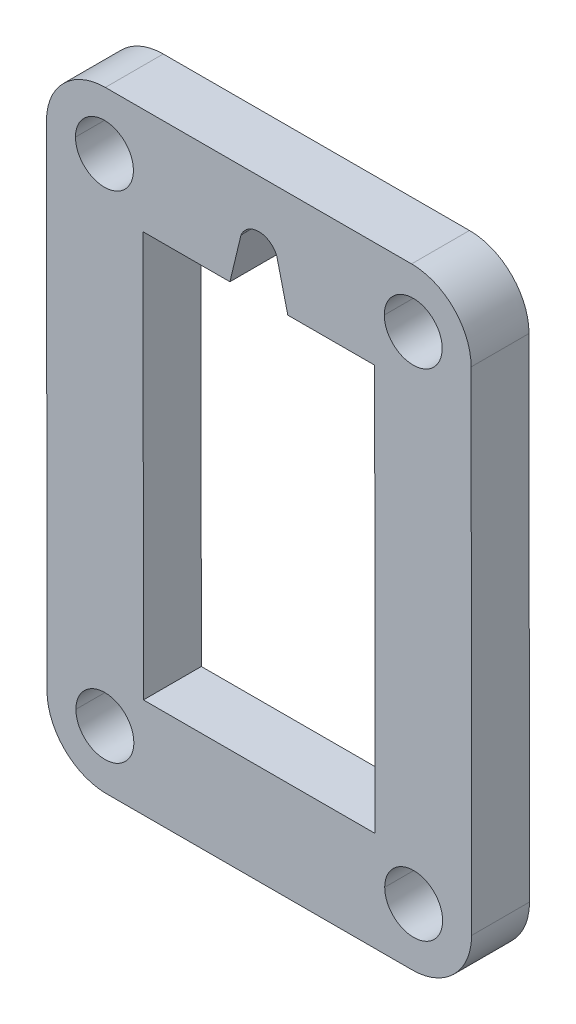
ISO-10303-21;
HEADER;
FILE_DESCRIPTION(('STEP AP214'),'2;1');
FILE_NAME('part.step','',(''),(''),'','','');
FILE_SCHEMA(('AUTOMOTIVE_DESIGN { 1 0 10303 214 1 1 1 1 }'));
ENDSEC;
DATA;
#1=APPLICATION_CONTEXT('core data for automotive mechanical design processes');
#2=APPLICATION_PROTOCOL_DEFINITION('international standard','automotive_design',2000,#1);
#3=PRODUCT_CONTEXT('',#1,'mechanical');
#4=PRODUCT('Part','Part','',(#3));
#5=PRODUCT_RELATED_PRODUCT_CATEGORY('part','',(#4));
#6=PRODUCT_DEFINITION_FORMATION('','',#4);
#7=PRODUCT_DEFINITION_CONTEXT('part definition',#1,'design');
#8=PRODUCT_DEFINITION('design','',#6,#7);
#9=PRODUCT_DEFINITION_SHAPE('','',#8);
#10=(LENGTH_UNIT() NAMED_UNIT(*) SI_UNIT(.MILLI.,.METRE.));
#11=(NAMED_UNIT(*) PLANE_ANGLE_UNIT() SI_UNIT($,.RADIAN.));
#12=(NAMED_UNIT(*) SI_UNIT($,.STERADIAN.) SOLID_ANGLE_UNIT());
#13=UNCERTAINTY_MEASURE_WITH_UNIT(LENGTH_MEASURE(1.E-05),#10,'distance_accuracy_value','');
#14=(GEOMETRIC_REPRESENTATION_CONTEXT(3) GLOBAL_UNCERTAINTY_ASSIGNED_CONTEXT((#13)) GLOBAL_UNIT_ASSIGNED_CONTEXT((#10,
#11,#12)) REPRESENTATION_CONTEXT('',''));
#15=CARTESIAN_POINT('',(0.,0.,0.));
#16=DIRECTION('',(0.,0.,1.));
#17=DIRECTION('',(1.,0.,0.));
#18=AXIS2_PLACEMENT_3D('',#15,#16,#17);
#19=CARTESIAN_POINT('',(256.429080282906,-89.7884732386483,3.175));
#20=DIRECTION('',(0.,0.,-1.));
#21=DIRECTION('',(-1.,0.,0.));
#22=AXIS2_PLACEMENT_3D('',#19,#20,#21);
#23=PLANE('',#22);
#24=CARTESIAN_POINT('',(273.963027726144,-60.3941966704141,3.175));
#25=CARTESIAN_POINT('',(273.963817429087,-61.2709515841344,3.175));
#26=CARTESIAN_POINT('',(274.675202046867,-61.9810558510021,3.175));
#27=CARTESIAN_POINT('',(275.551956960591,-61.9802661480576,3.175));
#28=CARTESIAN_POINT('',(276.428711874314,-61.9794764451143,3.175));
#29=CARTESIAN_POINT('',(277.13881614118,-61.2680918273298,3.175));
#30=CARTESIAN_POINT('',(277.138026438237,-60.3913369136096,3.175));
#31=B_SPLINE_CURVE_WITH_KNOTS('',3,(#24,#25,#26,#27,#28,#29,#30),.UNSPECIFIED.,.F.,.F.,(4,3,4),
(0.,1.,2.),.UNSPECIFIED.);
#32=CARTESIAN_POINT('',(273.963027726144,-60.3941966704141,3.175));
#33=VERTEX_POINT('',#32);
#34=CARTESIAN_POINT('',(277.138026438237,-60.3913369136096,3.175));
#35=VERTEX_POINT('',#34);
#36=EDGE_CURVE('E245',#33,#35,#31,.T.);
#37=ORIENTED_EDGE('',*,*,#36,.F.);
#38=CARTESIAN_POINT('',(277.138026438237,-60.3913369136096,3.175));
#39=CARTESIAN_POINT('',(277.137236735292,-59.51458199989,3.175));
#40=CARTESIAN_POINT('',(276.425852117509,-58.8044777330222,3.175));
#41=CARTESIAN_POINT('',(275.549097203786,-58.8052674359648,3.175));
#42=CARTESIAN_POINT('',(274.672342290063,-58.8060571389094,3.175));
#43=CARTESIAN_POINT('',(273.9622380232,-59.5174417566945,3.175));
#44=CARTESIAN_POINT('',(273.963027726144,-60.3941966704141,3.175));
#45=B_SPLINE_CURVE_WITH_KNOTS('',3,(#38,#39,#40,#41,#42,#43,#44),.UNSPECIFIED.,.F.,.F.,(4,3,4),
(2.,3.,4.),.UNSPECIFIED.);
#46=EDGE_CURVE('E239',#35,#33,#45,.T.);
#47=ORIENTED_EDGE('',*,*,#46,.F.);
#48=EDGE_LOOP('',(#37,#47));
#49=FACE_BOUND('',#48,.T.);
#50=CARTESIAN_POINT('',(257.053349860024,-87.573327313807,3.175));
#51=CARTESIAN_POINT('',(257.054139562969,-88.4500822275324,3.175));
#52=CARTESIAN_POINT('',(257.765524180748,-89.1601864943937,3.175));
#53=CARTESIAN_POINT('',(258.642279094475,-89.1593967914511,3.175));
#54=CARTESIAN_POINT('',(259.519034008194,-89.1586070885066,3.175));
#55=CARTESIAN_POINT('',(260.229138275062,-88.447222470726,3.175));
#56=CARTESIAN_POINT('',(260.228348572117,-87.5704675570012,3.175));
#57=B_SPLINE_CURVE_WITH_KNOTS('',3,(#50,#51,#52,#53,#54,#55,#56),.UNSPECIFIED.,.F.,.F.,(4,3,4),
(0.,1.,2.),.UNSPECIFIED.);
#58=CARTESIAN_POINT('',(257.053349860024,-87.573327313807,3.175));
#59=VERTEX_POINT('',#58);
#60=CARTESIAN_POINT('',(260.228348572117,-87.5704675570012,3.175));
#61=VERTEX_POINT('',#60);
#62=EDGE_CURVE('E308',#59,#61,#57,.T.);
#63=ORIENTED_EDGE('',*,*,#62,.F.);
#64=CARTESIAN_POINT('',(260.228348572117,-87.5704675570012,3.175));
#65=CARTESIAN_POINT('',(260.227558869172,-86.6937126432829,3.175));
#66=CARTESIAN_POINT('',(259.516174251389,-85.9836083764139,3.175));
#67=CARTESIAN_POINT('',(258.639419337667,-85.9843980793571,3.175));
#68=CARTESIAN_POINT('',(257.762664423944,-85.9851877823017,3.175));
#69=CARTESIAN_POINT('',(257.05256015708,-86.696572400088,3.175));
#70=CARTESIAN_POINT('',(257.053349860024,-87.573327313807,3.175));
#71=B_SPLINE_CURVE_WITH_KNOTS('',3,(#64,#65,#66,#67,#68,#69,#70),.UNSPECIFIED.,.F.,.F.,(4,3,4),
(2.,3.,4.),.UNSPECIFIED.);
#72=EDGE_CURVE('E302',#61,#59,#71,.T.);
#73=ORIENTED_EDGE('',*,*,#72,.F.);
#74=EDGE_LOOP('',(#63,#73));
#75=FACE_BOUND('',#74,.T.);
#76=CARTESIAN_POINT('',(255.466574963387,-87.4706715500865,3.175));
#77=CARTESIAN_POINT('',(255.468206151169,-89.2816713851328,3.175));
#78=CARTESIAN_POINT('',(256.937612252825,-90.7484328478704,3.175));
#79=CARTESIAN_POINT('',(258.748612087876,-90.7468016600902,3.175));
#80=B_SPLINE_CURVE_WITH_KNOTS('',3,(#76,#77,#78,#79),.UNSPECIFIED.,.F.,.F.,(4,4),(1.,2.),.UNSPECIFIED.);
#81=CARTESIAN_POINT('',(255.466574963387,-87.4706715500865,3.175));
#82=VERTEX_POINT('',#81);
#83=CARTESIAN_POINT('',(258.748612087876,-90.7468016600902,3.175));
#84=VERTEX_POINT('',#83);
#85=EDGE_CURVE('E432',#82,#84,#80,.T.);
#86=ORIENTED_EDGE('',*,*,#85,.T.);
#87=DIRECTION('',(0.999999594359941,0.000900710804771302,0.));
#88=VECTOR('',#87,1.);
#89=CARTESIAN_POINT('',(258.748612087876,-90.7468016600902,3.175));
#90=LINE('',#89,#88);
#91=CARTESIAN_POINT('',(275.489702302225,-90.7317227731339,3.175));
#92=VERTEX_POINT('',#91);
#93=EDGE_CURVE('E493',#84,#92,#90,.T.);
#94=ORIENTED_EDGE('',*,*,#93,.T.);
#95=CARTESIAN_POINT('',(275.489702302225,-90.7317227731339,3.175));
#96=CARTESIAN_POINT('',(277.291658765287,-90.7300997308182,3.175));
#97=CARTESIAN_POINT('',(278.751127509482,-89.267999496814,3.175));
#98=CARTESIAN_POINT('',(278.749504467165,-87.4660430337482,3.175));
#99=B_SPLINE_CURVE_WITH_KNOTS('',3,(#95,#96,#97,#98),.UNSPECIFIED.,.F.,.F.,(4,4),(3.,4.),.UNSPECIFIED.);
#100=CARTESIAN_POINT('',(278.749504467165,-87.4660430337482,3.175));
#101=VERTEX_POINT('',#100);
#102=EDGE_CURVE('E456',#92,#101,#99,.T.);
#103=ORIENTED_EDGE('',*,*,#102,.T.);
#104=DIRECTION('',(-0.000900710804769986,0.999999594359941,0.));
#105=VECTOR('',#104,1.);
#106=CARTESIAN_POINT('',(278.749504467165,-87.4660430337482,3.175));
#107=LINE('',#106,#105);
#108=CARTESIAN_POINT('',(278.725195719775,-60.4776496437625,3.175));
#109=VERTEX_POINT('',#108);
#110=EDGE_CURVE('E474',#101,#109,#107,.T.);
#111=ORIENTED_EDGE('',*,*,#110,.T.);
#112=CARTESIAN_POINT('',(278.725195719775,-60.4776496437625,3.175));
#113=CARTESIAN_POINT('',(278.723572677461,-58.6756931806992,3.175));
#114=CARTESIAN_POINT('',(277.261472443455,-57.2162244365057,3.175));
#115=CARTESIAN_POINT('',(275.459515980389,-57.2178474788188,3.175));
#116=B_SPLINE_CURVE_WITH_KNOTS('',3,(#112,#113,#114,#115),.UNSPECIFIED.,.F.,.F.,(4,4),(5.,6.),.UNSPECIFIED.);
#117=CARTESIAN_POINT('',(275.459515980389,-57.2178474788188,3.175));
#118=VERTEX_POINT('',#117);
#119=EDGE_CURVE('E471',#109,#118,#116,.T.);
#120=ORIENTED_EDGE('',*,*,#119,.T.);
#121=DIRECTION('',(-0.999999594359941,-0.000900710804881329,0.));
#122=VECTOR('',#121,1.);
#123=CARTESIAN_POINT('',(275.459515980389,-57.2178474788188,3.175));
#124=LINE('',#123,#122);
#125=CARTESIAN_POINT('',(258.666383313464,-57.2329732409954,3.175));
#126=VERTEX_POINT('',#125);
#127=EDGE_CURVE('E385',#118,#126,#124,.T.);
#128=ORIENTED_EDGE('',*,*,#127,.T.);
#129=CARTESIAN_POINT('',(258.666383313464,-57.2329732409954,3.175));
#130=CARTESIAN_POINT('',(256.912873486021,-57.2345526468851,3.175));
#131=CARTESIAN_POINT('',(255.440622499712,-58.6573687576679,3.175));
#132=CARTESIAN_POINT('',(255.442201905602,-60.4108785851117,3.175));
#133=B_SPLINE_CURVE_WITH_KNOTS('',3,(#129,#130,#131,#132),.UNSPECIFIED.,.F.,.F.,(4,4),(8.,9.),.UNSPECIFIED.);
#134=CARTESIAN_POINT('',(255.442201905602,-60.4108785851117,3.175));
#135=VERTEX_POINT('',#134);
#136=EDGE_CURVE('E378',#126,#135,#133,.T.);
#137=ORIENTED_EDGE('',*,*,#136,.T.);
#138=DIRECTION('',(0.000900710805231275,-0.99999959435994,0.));
#139=VECTOR('',#138,1.);
#140=CARTESIAN_POINT('',(255.442201905602,-60.4108785851117,3.175));
#141=LINE('',#140,#139);
#142=EDGE_CURVE('E384',#135,#82,#141,.T.);
#143=ORIENTED_EDGE('',*,*,#142,.T.);
#144=EDGE_LOOP('',(#86,#94,#103,#111,#120,#128,#137,#143));
#145=FACE_BOUND('',#144,.T.);
#146=CARTESIAN_POINT('',(273.986676324518,-87.5580752775126,3.175));
#147=CARTESIAN_POINT('',(273.987466027464,-88.4348301912374,3.175));
#148=CARTESIAN_POINT('',(274.698850645245,-89.1449344581012,3.175));
#149=CARTESIAN_POINT('',(275.575605558968,-89.1441447551567,3.175));
#150=CARTESIAN_POINT('',(276.452360472688,-89.1433550522109,3.175));
#151=CARTESIAN_POINT('',(277.162464739556,-88.4319704344322,3.175));
#152=CARTESIAN_POINT('',(277.161675036611,-87.5552155207068,3.175));
#153=B_SPLINE_CURVE_WITH_KNOTS('',3,(#146,#147,#148,#149,#150,#151,#152),.UNSPECIFIED.,.F.,.F.,
(4,3,4),(0.,1.,2.),.UNSPECIFIED.);
#154=CARTESIAN_POINT('',(273.986676324518,-87.5580752775126,3.175));
#155=VERTEX_POINT('',#154);
#156=CARTESIAN_POINT('',(277.161675036611,-87.5552155207068,3.175));
#157=VERTEX_POINT('',#156);
#158=EDGE_CURVE('E339',#155,#157,#153,.T.);
#159=ORIENTED_EDGE('',*,*,#158,.F.);
#160=CARTESIAN_POINT('',(277.161675036611,-87.5552155207068,3.175));
#161=CARTESIAN_POINT('',(277.160885333667,-86.6784606069878,3.175));
#162=CARTESIAN_POINT('',(276.449500715883,-85.9683563401195,3.175));
#163=CARTESIAN_POINT('',(275.572745802164,-85.9691460430634,3.175));
#164=CARTESIAN_POINT('',(274.695990888438,-85.9699357460073,3.175));
#165=CARTESIAN_POINT('',(273.985886621573,-86.6813203637937,3.175));
#166=CARTESIAN_POINT('',(273.986676324518,-87.5580752775126,3.175));
#167=B_SPLINE_CURVE_WITH_KNOTS('',3,(#160,#161,#162,#163,#164,#165,#166),.UNSPECIFIED.,.F.,.F.,
(4,3,4),(2.,3.,4.),.UNSPECIFIED.);
#168=EDGE_CURVE('E345',#157,#155,#167,.T.);
#169=ORIENTED_EDGE('',*,*,#168,.F.);
#170=EDGE_LOOP('',(#159,#169));
#171=FACE_BOUND('',#170,.T.);
#172=CARTESIAN_POINT('',(267.082978118885,-59.8712267266286,3.175));
#173=CARTESIAN_POINT('',(266.642307521266,-59.8716236435582,3.175));
#174=CARTESIAN_POINT('',(266.264795534188,-60.1412841216985,3.175));
#175=CARTESIAN_POINT('',(266.105912571669,-60.5244358753871,3.175));
#176=B_SPLINE_CURVE_WITH_KNOTS('',3,(#172,#173,#174,#175),.UNSPECIFIED.,.F.,.F.,(4,4),(5.,6.),.UNSPECIFIED.);
#177=CARTESIAN_POINT('',(267.082978118885,-59.8712267266286,3.175));
#178=VERTEX_POINT('',#177);
#179=CARTESIAN_POINT('',(266.105912571669,-60.5244358753871,3.175));
#180=VERTEX_POINT('',#179);
#181=EDGE_CURVE('E275',#178,#180,#176,.T.);
#182=ORIENTED_EDGE('',*,*,#181,.F.);
#183=CARTESIAN_POINT('',(268.06275090101,-60.5263983402516,3.175));
#184=CARTESIAN_POINT('',(267.904080531669,-60.1415516796852,3.175));
#185=CARTESIAN_POINT('',(267.525069817808,-59.8708285296969,3.175));
#186=CARTESIAN_POINT('',(267.082978118885,-59.8712267266286,3.175));
#187=B_SPLINE_CURVE_WITH_KNOTS('',3,(#183,#184,#185,#186),.UNSPECIFIED.,.F.,.F.,(4,4),(6.,7.),.UNSPECIFIED.);
#188=CARTESIAN_POINT('',(268.06275090101,-60.5263983402516,3.175));
#189=VERTEX_POINT('',#188);
#190=EDGE_CURVE('E533',#189,#178,#187,.T.);
#191=ORIENTED_EDGE('',*,*,#190,.F.);
#192=DIRECTION('',(-0.235624005462712,0.971844292080634,0.));
#193=VECTOR('',#192,1.);
#194=CARTESIAN_POINT('',(268.06275090101,-60.5263983402516,3.175));
#195=LINE('',#194,#193);
#196=CARTESIAN_POINT('',(268.673337231736,-63.0447955603188,3.175));
#197=VERTEX_POINT('',#196);
#198=EDGE_CURVE('E597',#197,#189,#195,.T.);
#199=ORIENTED_EDGE('',*,*,#198,.F.);
#200=DIRECTION('',(-0.999999594359941,-0.000900710804908462,0.));
#201=VECTOR('',#200,1.);
#202=CARTESIAN_POINT('',(268.673337231736,-63.0447955603188,3.175));
#203=LINE('',#202,#201);
#204=CARTESIAN_POINT('',(273.435835299875,-63.0405059251104,3.175));
#205=VERTEX_POINT('',#204);
#206=EDGE_CURVE('E640',#205,#197,#203,.T.);
#207=ORIENTED_EDGE('',*,*,#206,.F.);
#208=DIRECTION('',(-0.000900710804858463,0.999999594359941,0.));
#209=VECTOR('',#208,1.);
#210=CARTESIAN_POINT('',(273.435835299875,-63.0405059251104,3.175));
#211=LINE('',#210,#209);
#212=CARTESIAN_POINT('',(273.455853597513,-85.2654969097612,3.175));
#213=VERTEX_POINT('',#212);
#214=EDGE_CURVE('E641',#213,#205,#211,.T.);
#215=ORIENTED_EDGE('',*,*,#214,.F.);
#216=DIRECTION('',(0.999999594359941,0.000900710804775148,0.));
#217=VECTOR('',#216,1.);
#218=CARTESIAN_POINT('',(273.455853597513,-85.2654969097612,3.175));
#219=LINE('',#218,#217);
#220=CARTESIAN_POINT('',(260.755858749142,-85.2769359369819,3.175));
#221=VERTEX_POINT('',#220);
#222=EDGE_CURVE('E643',#221,#213,#219,.T.);
#223=ORIENTED_EDGE('',*,*,#222,.F.);
#224=DIRECTION('',(0.000900710804868478,-0.999999594359941,0.));
#225=VECTOR('',#224,1.);
#226=CARTESIAN_POINT('',(260.755858749142,-85.2769359369819,3.175));
#227=LINE('',#226,#225);
#228=CARTESIAN_POINT('',(260.735840451504,-63.0519449523316,3.175));
#229=VERTEX_POINT('',#228);
#230=EDGE_CURVE('E647',#229,#221,#227,.T.);
#231=ORIENTED_EDGE('',*,*,#230,.F.);
#232=DIRECTION('',(-0.999999594359941,-0.000900710804765625,0.));
#233=VECTOR('',#232,1.);
#234=CARTESIAN_POINT('',(260.735840451504,-63.0519449523316,3.175));
#235=LINE('',#234,#233);
#236=CARTESIAN_POINT('',(265.498338519643,-63.0476553171239,3.175));
#237=VERTEX_POINT('',#236);
#238=EDGE_CURVE('E648',#237,#229,#235,.T.);
#239=ORIENTED_EDGE('',*,*,#238,.F.);
#240=DIRECTION('',(-0.234102034358403,-0.972212033205338,0.));
#241=VECTOR('',#240,1.);
#242=CARTESIAN_POINT('',(265.498338519643,-63.0476553171239,3.175));
#243=LINE('',#242,#241);
#244=EDGE_CURVE('E280',#180,#237,#243,.T.);
#245=ORIENTED_EDGE('',*,*,#244,.F.);
#246=EDGE_LOOP('',(#182,#191,#199,#207,#215,#223,#231,#239,#245));
#247=FACE_BOUND('',#246,.T.);
#248=CARTESIAN_POINT('',(257.02970126165,-60.4094487067091,3.175));
#249=CARTESIAN_POINT('',(257.030490964593,-61.2862036204294,3.175));
#250=CARTESIAN_POINT('',(257.741875582373,-61.9963078872958,3.175));
#251=CARTESIAN_POINT('',(258.618630496097,-61.9955181843513,3.175));
#252=CARTESIAN_POINT('',(259.495385409818,-61.9947284814093,3.175));
#253=CARTESIAN_POINT('',(260.205489676686,-61.2833438636242,3.175));
#254=CARTESIAN_POINT('',(260.204699973742,-60.4065889499039,3.175));
#255=B_SPLINE_CURVE_WITH_KNOTS('',3,(#248,#249,#250,#251,#252,#253,#254),.UNSPECIFIED.,.F.,.F.,
(4,3,4),(0.,1.,2.),.UNSPECIFIED.);
#256=CARTESIAN_POINT('',(257.02970126165,-60.4094487067091,3.175));
#257=VERTEX_POINT('',#256);
#258=CARTESIAN_POINT('',(260.204699973742,-60.4065889499039,3.175));
#259=VERTEX_POINT('',#258);
#260=EDGE_CURVE('E210',#257,#259,#255,.T.);
#261=ORIENTED_EDGE('',*,*,#260,.F.);
#262=CARTESIAN_POINT('',(260.204699973742,-60.4065889499039,3.175));
#263=CARTESIAN_POINT('',(260.203910270797,-59.5298340361849,3.175));
#264=CARTESIAN_POINT('',(259.492525653015,-58.8197297693172,3.175));
#265=CARTESIAN_POINT('',(258.615770739292,-58.8205194722598,3.175));
#266=CARTESIAN_POINT('',(257.739015825569,-58.8213091752037,3.175));
#267=CARTESIAN_POINT('',(257.028911558704,-59.5326937929901,3.175));
#268=CARTESIAN_POINT('',(257.02970126165,-60.4094487067091,3.175));
#269=B_SPLINE_CURVE_WITH_KNOTS('',3,(#262,#263,#264,#265,#266,#267,#268),.UNSPECIFIED.,.F.,.F.,
(4,3,4),(2.,3.,4.),.UNSPECIFIED.);
#270=EDGE_CURVE('E204',#259,#257,#269,.T.);
#271=ORIENTED_EDGE('',*,*,#270,.F.);
#272=EDGE_LOOP('',(#261,#271));
#273=FACE_BOUND('',#272,.T.);
#274=ADVANCED_FACE('F37',(#49,#75,#145,#171,#247,#273),#23,.F.);
#275=CARTESIAN_POINT('',(256.429080282906,-89.7884732386483,0.));
#276=DIRECTION('',(0.,0.,-1.));
#277=DIRECTION('',(-1.,0.,0.));
#278=AXIS2_PLACEMENT_3D('',#275,#276,#277);
#279=PLANE('',#278);
#280=CARTESIAN_POINT('',(277.138026438237,-60.3913369136096,0.));
#281=CARTESIAN_POINT('',(277.137236735292,-59.51458199989,0.));
#282=CARTESIAN_POINT('',(276.425852117509,-58.8044777330222,0.));
#283=CARTESIAN_POINT('',(275.549097203786,-58.8052674359648,0.));
#284=CARTESIAN_POINT('',(274.672342290063,-58.8060571389094,0.));
#285=CARTESIAN_POINT('',(273.9622380232,-59.5174417566945,0.));
#286=CARTESIAN_POINT('',(273.963027726144,-60.3941966704141,0.));
#287=B_SPLINE_CURVE_WITH_KNOTS('',3,(#280,#281,#282,#283,#284,#285,#286),.UNSPECIFIED.,.F.,.F.,
(4,3,4),(2.,3.,4.),.UNSPECIFIED.);
#288=CARTESIAN_POINT('',(277.138026438237,-60.3913369136096,0.));
#289=VERTEX_POINT('',#288);
#290=CARTESIAN_POINT('',(273.963027726144,-60.3941966704141,0.));
#291=VERTEX_POINT('',#290);
#292=EDGE_CURVE('E258',#289,#291,#287,.T.);
#293=ORIENTED_EDGE('',*,*,#292,.T.);
#294=CARTESIAN_POINT('',(273.963027726144,-60.3941966704141,0.));
#295=CARTESIAN_POINT('',(273.963817429087,-61.2709515841344,0.));
#296=CARTESIAN_POINT('',(274.675202046867,-61.9810558510021,0.));
#297=CARTESIAN_POINT('',(275.551956960591,-61.9802661480576,0.));
#298=CARTESIAN_POINT('',(276.428711874314,-61.9794764451143,0.));
#299=CARTESIAN_POINT('',(277.13881614118,-61.2680918273298,0.));
#300=CARTESIAN_POINT('',(277.138026438237,-60.3913369136096,0.));
#301=B_SPLINE_CURVE_WITH_KNOTS('',3,(#294,#295,#296,#297,#298,#299,#300),.UNSPECIFIED.,.F.,.F.,
(4,3,4),(0.,1.,2.),.UNSPECIFIED.);
#302=EDGE_CURVE('E250',#291,#289,#301,.T.);
#303=ORIENTED_EDGE('',*,*,#302,.T.);
#304=EDGE_LOOP('',(#293,#303));
#305=FACE_BOUND('',#304,.T.);
#306=CARTESIAN_POINT('',(260.228348572117,-87.5704675570012,0.));
#307=CARTESIAN_POINT('',(260.227558869172,-86.6937126432829,0.));
#308=CARTESIAN_POINT('',(259.516174251389,-85.9836083764139,0.));
#309=CARTESIAN_POINT('',(258.639419337667,-85.9843980793571,0.));
#310=CARTESIAN_POINT('',(257.762664423944,-85.9851877823017,0.));
#311=CARTESIAN_POINT('',(257.05256015708,-86.696572400088,0.));
#312=CARTESIAN_POINT('',(257.053349860024,-87.573327313807,0.));
#313=B_SPLINE_CURVE_WITH_KNOTS('',3,(#306,#307,#308,#309,#310,#311,#312),.UNSPECIFIED.,.F.,.F.,
(4,3,4),(2.,3.,4.),.UNSPECIFIED.);
#314=CARTESIAN_POINT('',(260.228348572117,-87.5704675570012,0.));
#315=VERTEX_POINT('',#314);
#316=CARTESIAN_POINT('',(257.053349860024,-87.573327313807,0.));
#317=VERTEX_POINT('',#316);
#318=EDGE_CURVE('E321',#315,#317,#313,.T.);
#319=ORIENTED_EDGE('',*,*,#318,.T.);
#320=CARTESIAN_POINT('',(257.053349860024,-87.573327313807,0.));
#321=CARTESIAN_POINT('',(257.054139562969,-88.4500822275324,0.));
#322=CARTESIAN_POINT('',(257.765524180748,-89.1601864943937,0.));
#323=CARTESIAN_POINT('',(258.642279094475,-89.1593967914511,0.));
#324=CARTESIAN_POINT('',(259.519034008194,-89.1586070885066,0.));
#325=CARTESIAN_POINT('',(260.229138275062,-88.447222470726,0.));
#326=CARTESIAN_POINT('',(260.228348572117,-87.5704675570012,0.));
#327=B_SPLINE_CURVE_WITH_KNOTS('',3,(#320,#321,#322,#323,#324,#325,#326),.UNSPECIFIED.,.F.,.F.,
(4,3,4),(0.,1.,2.),.UNSPECIFIED.);
#328=EDGE_CURVE('E313',#317,#315,#327,.T.);
#329=ORIENTED_EDGE('',*,*,#328,.T.);
#330=EDGE_LOOP('',(#319,#329));
#331=FACE_BOUND('',#330,.T.);
#332=CARTESIAN_POINT('',(255.466574963387,-87.4706715500865,0.));
#333=CARTESIAN_POINT('',(255.468206151169,-89.2816713851328,0.));
#334=CARTESIAN_POINT('',(256.937612252825,-90.7484328478704,0.));
#335=CARTESIAN_POINT('',(258.748612087876,-90.7468016600902,0.));
#336=B_SPLINE_CURVE_WITH_KNOTS('',3,(#332,#333,#334,#335),.UNSPECIFIED.,.F.,.F.,(4,4),(1.,2.),.UNSPECIFIED.);
#337=CARTESIAN_POINT('',(255.466574963387,-87.4706715500865,0.));
#338=VERTEX_POINT('',#337);
#339=CARTESIAN_POINT('',(258.748612087876,-90.7468016600902,0.));
#340=VERTEX_POINT('',#339);
#341=EDGE_CURVE('E392',#338,#340,#336,.T.);
#342=ORIENTED_EDGE('',*,*,#341,.F.);
#343=DIRECTION('',(0.000900710804481159,-0.999999594359941,0.));
#344=VECTOR('',#343,1.);
#345=CARTESIAN_POINT('',(255.463068592328,-83.5777798254368,0.));
#346=LINE('',#345,#344);
#347=CARTESIAN_POINT('',(255.442201905602,-60.4108785851117,0.));
#348=VERTEX_POINT('',#347);
#349=EDGE_CURVE('E427',#348,#338,#346,.T.);
#350=ORIENTED_EDGE('',*,*,#349,.F.);
#351=CARTESIAN_POINT('',(258.666383313464,-57.2329732409954,0.));
#352=CARTESIAN_POINT('',(256.912873486021,-57.2345526468851,0.));
#353=CARTESIAN_POINT('',(255.440622499712,-58.6573687576679,0.));
#354=CARTESIAN_POINT('',(255.442201905602,-60.4108785851117,0.));
#355=B_SPLINE_CURVE_WITH_KNOTS('',3,(#351,#352,#353,#354),.UNSPECIFIED.,.F.,.F.,(4,4),(8.,9.),.UNSPECIFIED.);
#356=CARTESIAN_POINT('',(258.666383313464,-57.2329732409954,0.));
#357=VERTEX_POINT('',#356);
#358=EDGE_CURVE('E422',#357,#348,#355,.T.);
#359=ORIENTED_EDGE('',*,*,#358,.F.);
#360=DIRECTION('',(-0.999999594359938,-0.000900710807447061,0.));
#361=VECTOR('',#360,1.);
#362=CARTESIAN_POINT('',(258.701673996036,-57.2329414542833,0.));
#363=LINE('',#362,#361);
#364=CARTESIAN_POINT('',(275.459515980389,-57.2178474788188,0.));
#365=VERTEX_POINT('',#364);
#366=EDGE_CURVE('E417',#365,#357,#363,.T.);
#367=ORIENTED_EDGE('',*,*,#366,.F.);
#368=CARTESIAN_POINT('',(278.725195719775,-60.4776496437625,0.));
#369=CARTESIAN_POINT('',(278.723572677461,-58.6756931806992,0.));
#370=CARTESIAN_POINT('',(277.261472443455,-57.2162244365057,0.));
#371=CARTESIAN_POINT('',(275.459515980389,-57.2178474788188,0.));
#372=B_SPLINE_CURVE_WITH_KNOTS('',3,(#368,#369,#370,#371),.UNSPECIFIED.,.F.,.F.,(4,4),(5.,6.),.UNSPECIFIED.);
#373=CARTESIAN_POINT('',(278.725195719775,-60.4776496437625,0.));
#374=VERTEX_POINT('',#373);
#375=EDGE_CURVE('E412',#374,#365,#372,.T.);
#376=ORIENTED_EDGE('',*,*,#375,.F.);
#377=DIRECTION('',(-0.000900710804769986,0.999999594359941,0.));
#378=VECTOR('',#377,1.);
#379=CARTESIAN_POINT('',(278.749504467165,-87.4660430337482,0.));
#380=LINE('',#379,#378);
#381=CARTESIAN_POINT('',(278.749504467165,-87.4660430337482,0.));
#382=VERTEX_POINT('',#381);
#383=EDGE_CURVE('E407',#382,#374,#380,.T.);
#384=ORIENTED_EDGE('',*,*,#383,.F.);
#385=CARTESIAN_POINT('',(275.489702302225,-90.7317227731339,0.));
#386=CARTESIAN_POINT('',(277.291658765287,-90.7300997308182,0.));
#387=CARTESIAN_POINT('',(278.751127509482,-89.267999496814,0.));
#388=CARTESIAN_POINT('',(278.749504467165,-87.4660430337482,0.));
#389=B_SPLINE_CURVE_WITH_KNOTS('',3,(#385,#386,#387,#388),.UNSPECIFIED.,.F.,.F.,(4,4),(3.,4.),.UNSPECIFIED.);
#390=CARTESIAN_POINT('',(275.489702302225,-90.7317227731339,0.));
#391=VERTEX_POINT('',#390);
#392=EDGE_CURVE('E403',#391,#382,#389,.T.);
#393=ORIENTED_EDGE('',*,*,#392,.F.);
#394=DIRECTION('',(0.999999594359941,0.000900710804771302,0.));
#395=VECTOR('',#394,1.);
#396=CARTESIAN_POINT('',(258.748612087876,-90.7468016600902,0.));
#397=LINE('',#396,#395);
#398=EDGE_CURVE('E397',#340,#391,#397,.T.);
#399=ORIENTED_EDGE('',*,*,#398,.F.);
#400=EDGE_LOOP('',(#342,#350,#359,#367,#376,#384,#393,#399));
#401=FACE_BOUND('',#400,.T.);
#402=CARTESIAN_POINT('',(277.161675036611,-87.5552155207068,0.));
#403=CARTESIAN_POINT('',(277.160885333667,-86.6784606069878,0.));
#404=CARTESIAN_POINT('',(276.449500715883,-85.9683563401195,0.));
#405=CARTESIAN_POINT('',(275.572745802164,-85.9691460430634,0.));
#406=CARTESIAN_POINT('',(274.695990888438,-85.9699357460073,0.));
#407=CARTESIAN_POINT('',(273.985886621573,-86.6813203637937,0.));
#408=CARTESIAN_POINT('',(273.986676324518,-87.5580752775126,0.));
#409=B_SPLINE_CURVE_WITH_KNOTS('',3,(#402,#403,#404,#405,#406,#407,#408),.UNSPECIFIED.,.F.,.F.,
(4,3,4),(2.,3.,4.),.UNSPECIFIED.);
#410=CARTESIAN_POINT('',(277.161675036611,-87.5552155207068,0.));
#411=VERTEX_POINT('',#410);
#412=CARTESIAN_POINT('',(273.986676324518,-87.5580752775126,0.));
#413=VERTEX_POINT('',#412);
#414=EDGE_CURVE('E346',#411,#413,#409,.T.);
#415=ORIENTED_EDGE('',*,*,#414,.T.);
#416=CARTESIAN_POINT('',(273.986676324518,-87.5580752775126,0.));
#417=CARTESIAN_POINT('',(273.987466027464,-88.4348301912374,0.));
#418=CARTESIAN_POINT('',(274.698850645245,-89.1449344581012,0.));
#419=CARTESIAN_POINT('',(275.575605558968,-89.1441447551567,0.));
#420=CARTESIAN_POINT('',(276.452360472688,-89.1433550522109,0.));
#421=CARTESIAN_POINT('',(277.162464739556,-88.4319704344322,0.));
#422=CARTESIAN_POINT('',(277.161675036611,-87.5552155207068,0.));
#423=B_SPLINE_CURVE_WITH_KNOTS('',3,(#416,#417,#418,#419,#420,#421,#422),.UNSPECIFIED.,.F.,.F.,
(4,3,4),(0.,1.,2.),.UNSPECIFIED.);
#424=EDGE_CURVE('E338',#413,#411,#423,.T.);
#425=ORIENTED_EDGE('',*,*,#424,.T.);
#426=EDGE_LOOP('',(#415,#425));
#427=FACE_BOUND('',#426,.T.);
#428=CARTESIAN_POINT('',(268.06275090101,-60.5263983402516,0.));
#429=CARTESIAN_POINT('',(267.904080531669,-60.1415516796852,0.));
#430=CARTESIAN_POINT('',(267.525069817808,-59.8708285296969,0.));
#431=CARTESIAN_POINT('',(267.082978118885,-59.8712267266286,0.));
#432=B_SPLINE_CURVE_WITH_KNOTS('',3,(#428,#429,#430,#431),.UNSPECIFIED.,.F.,.F.,(4,4),(6.,7.),.UNSPECIFIED.);
#433=CARTESIAN_POINT('',(268.06275090101,-60.5263983402516,0.));
#434=VERTEX_POINT('',#433);
#435=CARTESIAN_POINT('',(267.082978118885,-59.8712267266286,0.));
#436=VERTEX_POINT('',#435);
#437=EDGE_CURVE('E281',#434,#436,#432,.T.);
#438=ORIENTED_EDGE('',*,*,#437,.T.);
#439=CARTESIAN_POINT('',(267.082978118885,-59.8712267266286,0.));
#440=CARTESIAN_POINT('',(266.642307521266,-59.8716236435582,0.));
#441=CARTESIAN_POINT('',(266.264795534188,-60.1412841216985,0.));
#442=CARTESIAN_POINT('',(266.105912571669,-60.5244358753871,0.));
#443=B_SPLINE_CURVE_WITH_KNOTS('',3,(#439,#440,#441,#442),.UNSPECIFIED.,.F.,.F.,(4,4),(5.,6.),.UNSPECIFIED.);
#444=CARTESIAN_POINT('',(266.105912571669,-60.5244358753871,0.));
#445=VERTEX_POINT('',#444);
#446=EDGE_CURVE('E274',#436,#445,#443,.T.);
#447=ORIENTED_EDGE('',*,*,#446,.T.);
#448=DIRECTION('',(-0.234102034358403,-0.972212033205338,0.));
#449=VECTOR('',#448,1.);
#450=CARTESIAN_POINT('',(265.498338519643,-63.0476553171239,0.));
#451=LINE('',#450,#449);
#452=CARTESIAN_POINT('',(265.498338519643,-63.0476553171239,0.));
#453=VERTEX_POINT('',#452);
#454=EDGE_CURVE('E544',#445,#453,#451,.T.);
#455=ORIENTED_EDGE('',*,*,#454,.T.);
#456=DIRECTION('',(-0.999999594359941,-0.000900710804765625,0.));
#457=VECTOR('',#456,1.);
#458=CARTESIAN_POINT('',(260.735840451504,-63.0519449523316,0.));
#459=LINE('',#458,#457);
#460=CARTESIAN_POINT('',(260.735840451504,-63.0519449523316,0.));
#461=VERTEX_POINT('',#460);
#462=EDGE_CURVE('E583',#453,#461,#459,.T.);
#463=ORIENTED_EDGE('',*,*,#462,.T.);
#464=DIRECTION('',(0.000900710804868478,-0.999999594359941,0.));
#465=VECTOR('',#464,1.);
#466=CARTESIAN_POINT('',(260.755858749142,-85.2769359369819,0.));
#467=LINE('',#466,#465);
#468=CARTESIAN_POINT('',(260.755858749142,-85.2769359369819,0.));
#469=VERTEX_POINT('',#468);
#470=EDGE_CURVE('E580',#461,#469,#467,.T.);
#471=ORIENTED_EDGE('',*,*,#470,.T.);
#472=DIRECTION('',(0.999999594359941,0.000900710804775148,0.));
#473=VECTOR('',#472,1.);
#474=CARTESIAN_POINT('',(273.455853597513,-85.2654969097612,0.));
#475=LINE('',#474,#473);
#476=CARTESIAN_POINT('',(273.455853597513,-85.2654969097612,0.));
#477=VERTEX_POINT('',#476);
#478=EDGE_CURVE('E577',#469,#477,#475,.T.);
#479=ORIENTED_EDGE('',*,*,#478,.T.);
#480=DIRECTION('',(-0.000900710804858463,0.999999594359941,0.));
#481=VECTOR('',#480,1.);
#482=CARTESIAN_POINT('',(273.435835299875,-63.0405059251104,0.));
#483=LINE('',#482,#481);
#484=CARTESIAN_POINT('',(273.435835299875,-63.0405059251104,0.));
#485=VERTEX_POINT('',#484);
#486=EDGE_CURVE('E574',#477,#485,#483,.T.);
#487=ORIENTED_EDGE('',*,*,#486,.T.);
#488=DIRECTION('',(-0.999999594359941,-0.000900710804908462,0.));
#489=VECTOR('',#488,1.);
#490=CARTESIAN_POINT('',(268.673337231736,-63.0447955603188,0.));
#491=LINE('',#490,#489);
#492=CARTESIAN_POINT('',(268.673337231736,-63.0447955603188,0.));
#493=VERTEX_POINT('',#492);
#494=EDGE_CURVE('E571',#485,#493,#491,.T.);
#495=ORIENTED_EDGE('',*,*,#494,.T.);
#496=DIRECTION('',(-0.235624005462712,0.971844292080634,0.));
#497=VECTOR('',#496,1.);
#498=CARTESIAN_POINT('',(268.06275090101,-60.5263983402516,0.));
#499=LINE('',#498,#497);
#500=EDGE_CURVE('E565',#493,#434,#499,.T.);
#501=ORIENTED_EDGE('',*,*,#500,.T.);
#502=EDGE_LOOP('',(#438,#447,#455,#463,#471,#479,#487,#495,#501));
#503=FACE_BOUND('',#502,.T.);
#504=CARTESIAN_POINT('',(260.204699973742,-60.4065889499039,0.));
#505=CARTESIAN_POINT('',(260.203910270797,-59.5298340361849,0.));
#506=CARTESIAN_POINT('',(259.492525653015,-58.8197297693172,0.));
#507=CARTESIAN_POINT('',(258.615770739292,-58.8205194722598,0.));
#508=CARTESIAN_POINT('',(257.739015825569,-58.8213091752037,0.));
#509=CARTESIAN_POINT('',(257.028911558704,-59.5326937929901,0.));
#510=CARTESIAN_POINT('',(257.02970126165,-60.4094487067091,0.));
#511=B_SPLINE_CURVE_WITH_KNOTS('',3,(#504,#505,#506,#507,#508,#509,#510),.UNSPECIFIED.,.F.,.F.,
(4,3,4),(2.,3.,4.),.UNSPECIFIED.);
#512=CARTESIAN_POINT('',(260.204699973742,-60.4065889499039,0.));
#513=VERTEX_POINT('',#512);
#514=CARTESIAN_POINT('',(257.02970126165,-60.4094487067091,0.));
#515=VERTEX_POINT('',#514);
#516=EDGE_CURVE('E214',#513,#515,#511,.T.);
#517=ORIENTED_EDGE('',*,*,#516,.T.);
#518=CARTESIAN_POINT('',(257.02970126165,-60.4094487067091,0.));
#519=CARTESIAN_POINT('',(257.030490964593,-61.2862036204294,0.));
#520=CARTESIAN_POINT('',(257.741875582373,-61.9963078872958,0.));
#521=CARTESIAN_POINT('',(258.618630496097,-61.9955181843513,0.));
#522=CARTESIAN_POINT('',(259.495385409818,-61.9947284814093,0.));
#523=CARTESIAN_POINT('',(260.205489676686,-61.2833438636242,0.));
#524=CARTESIAN_POINT('',(260.204699973742,-60.4065889499039,0.));
#525=B_SPLINE_CURVE_WITH_KNOTS('',3,(#518,#519,#520,#521,#522,#523,#524),.UNSPECIFIED.,.F.,.F.,
(4,3,4),(0.,1.,2.),.UNSPECIFIED.);
#526=EDGE_CURVE('E60',#515,#513,#525,.T.);
#527=ORIENTED_EDGE('',*,*,#526,.T.);
#528=EDGE_LOOP('',(#517,#527));
#529=FACE_BOUND('',#528,.T.);
#530=ADVANCED_FACE('F363',(#305,#331,#401,#427,#503,#529),#279,.T.);
#531=DIRECTION('',(0.,0.,-1.));
#532=VECTOR('',#531,1.);
#533=SURFACE_OF_LINEAR_EXTRUSION('',#80,#532);
#534=ORIENTED_EDGE('',*,*,#341,.T.);
#535=DIRECTION('',(0.,0.,-1.));
#536=VECTOR('',#535,1.);
#537=CARTESIAN_POINT('',(258.748612087876,-90.7468016600902,3.175));
#538=LINE('',#537,#536);
#539=EDGE_CURVE('E11',#84,#340,#538,.T.);
#540=ORIENTED_EDGE('',*,*,#539,.F.);
#541=ORIENTED_EDGE('',*,*,#85,.F.);
#542=DIRECTION('',(0.,0.,-1.));
#543=VECTOR('',#542,1.);
#544=CARTESIAN_POINT('',(255.466574963387,-87.4706715500865,3.175));
#545=LINE('',#544,#543);
#546=EDGE_CURVE('E391',#82,#338,#545,.T.);
#547=ORIENTED_EDGE('',*,*,#546,.T.);
#548=EDGE_LOOP('',(#534,#540,#541,#547));
#549=FACE_BOUND('',#548,.T.);
#550=ADVANCED_FACE('F39',(#549),#533,.F.);
#551=CARTESIAN_POINT('',(258.748612087876,-90.7468016600902,3.175));
#552=DIRECTION('',(-0.000900710804771302,0.999999594359941,0.));
#553=DIRECTION('',(-0.999999594359941,-0.000900710804771302,0.));
#554=AXIS2_PLACEMENT_3D('',#551,#552,#553);
#555=PLANE('',#554);
#556=ORIENTED_EDGE('',*,*,#398,.T.);
#557=DIRECTION('',(0.,0.,-1.));
#558=VECTOR('',#557,1.);
#559=CARTESIAN_POINT('',(275.489702302225,-90.7317227731339,3.175));
#560=LINE('',#559,#558);
#561=EDGE_CURVE('E46',#92,#391,#560,.T.);
#562=ORIENTED_EDGE('',*,*,#561,.F.);
#563=ORIENTED_EDGE('',*,*,#93,.F.);
#564=ORIENTED_EDGE('',*,*,#539,.T.);
#565=EDGE_LOOP('',(#556,#562,#563,#564));
#566=FACE_BOUND('',#565,.T.);
#567=ADVANCED_FACE('F488',(#566),#555,.F.);
#568=DIRECTION('',(0.,0.,-1.));
#569=VECTOR('',#568,1.);
#570=SURFACE_OF_LINEAR_EXTRUSION('',#99,#569);
#571=ORIENTED_EDGE('',*,*,#392,.T.);
#572=DIRECTION('',(0.,0.,-1.));
#573=VECTOR('',#572,1.);
#574=CARTESIAN_POINT('',(278.749504467165,-87.4660430337482,3.175));
#575=LINE('',#574,#573);
#576=EDGE_CURVE('E447',#101,#382,#575,.T.);
#577=ORIENTED_EDGE('',*,*,#576,.F.);
#578=ORIENTED_EDGE('',*,*,#102,.F.);
#579=ORIENTED_EDGE('',*,*,#561,.T.);
#580=EDGE_LOOP('',(#571,#577,#578,#579));
#581=FACE_BOUND('',#580,.T.);
#582=ADVANCED_FACE('F454',(#581),#570,.F.);
#583=CARTESIAN_POINT('',(278.749504467165,-87.4660430337482,3.175));
#584=DIRECTION('',(-0.999999594359941,-0.000900710804769986,0.));
#585=DIRECTION('',(0.000900710804769986,-0.999999594359941,0.));
#586=AXIS2_PLACEMENT_3D('',#583,#584,#585);
#587=PLANE('',#586);
#588=ORIENTED_EDGE('',*,*,#383,.T.);
#589=DIRECTION('',(0.,0.,-1.));
#590=VECTOR('',#589,1.);
#591=CARTESIAN_POINT('',(278.725195719775,-60.4776496437625,3.175));
#592=LINE('',#591,#590);
#593=EDGE_CURVE('E444',#109,#374,#592,.T.);
#594=ORIENTED_EDGE('',*,*,#593,.F.);
#595=ORIENTED_EDGE('',*,*,#110,.F.);
#596=ORIENTED_EDGE('',*,*,#576,.T.);
#597=EDGE_LOOP('',(#588,#594,#595,#596));
#598=FACE_BOUND('',#597,.T.);
#599=ADVANCED_FACE('F465',(#598),#587,.F.);
#600=DIRECTION('',(0.,0.,-1.));
#601=VECTOR('',#600,1.);
#602=SURFACE_OF_LINEAR_EXTRUSION('',#116,#601);
#603=ORIENTED_EDGE('',*,*,#375,.T.);
#604=DIRECTION('',(0.,0.,-1.));
#605=VECTOR('',#604,1.);
#606=CARTESIAN_POINT('',(275.459515980389,-57.2178474788188,3.175));
#607=LINE('',#606,#605);
#608=EDGE_CURVE('E441',#118,#365,#607,.T.);
#609=ORIENTED_EDGE('',*,*,#608,.F.);
#610=ORIENTED_EDGE('',*,*,#119,.F.);
#611=ORIENTED_EDGE('',*,*,#593,.T.);
#612=EDGE_LOOP('',(#603,#609,#610,#611));
#613=FACE_BOUND('',#612,.T.);
#614=ADVANCED_FACE('F469',(#613),#602,.F.);
#615=CARTESIAN_POINT('',(258.701673996036,-57.2329414542833,3.175));
#616=DIRECTION('',(0.000900710807447061,-0.999999594359938,0.));
#617=DIRECTION('',(0.999999594359939,0.000900710807447061,0.));
#618=AXIS2_PLACEMENT_3D('',#615,#616,#617);
#619=PLANE('',#618);
#620=ORIENTED_EDGE('',*,*,#366,.T.);
#621=DIRECTION('',(0.,0.,-1.));
#622=VECTOR('',#621,1.);
#623=CARTESIAN_POINT('',(258.666383313464,-57.2329732409954,3.175));
#624=LINE('',#623,#622);
#625=EDGE_CURVE('E438',#126,#357,#624,.T.);
#626=ORIENTED_EDGE('',*,*,#625,.F.);
#627=ORIENTED_EDGE('',*,*,#127,.F.);
#628=ORIENTED_EDGE('',*,*,#608,.T.);
#629=EDGE_LOOP('',(#620,#626,#627,#628));
#630=FACE_BOUND('',#629,.T.);
#631=ADVANCED_FACE('F375',(#630),#619,.F.);
#632=DIRECTION('',(0.,0.,-1.));
#633=VECTOR('',#632,1.);
#634=SURFACE_OF_LINEAR_EXTRUSION('',#133,#633);
#635=ORIENTED_EDGE('',*,*,#358,.T.);
#636=DIRECTION('',(0.,0.,-1.));
#637=VECTOR('',#636,1.);
#638=CARTESIAN_POINT('',(255.442201905602,-60.4108785851117,3.175));
#639=LINE('',#638,#637);
#640=EDGE_CURVE('E435',#135,#348,#639,.T.);
#641=ORIENTED_EDGE('',*,*,#640,.F.);
#642=ORIENTED_EDGE('',*,*,#136,.F.);
#643=ORIENTED_EDGE('',*,*,#625,.T.);
#644=EDGE_LOOP('',(#635,#641,#642,#643));
#645=FACE_BOUND('',#644,.T.);
#646=ADVANCED_FACE('F370',(#645),#634,.F.);
#647=CARTESIAN_POINT('',(255.463068592328,-83.5777798254368,3.175));
#648=DIRECTION('',(0.999999594359941,0.000900710804481159,0.));
#649=DIRECTION('',(-0.000900710804481159,0.999999594359941,0.));
#650=AXIS2_PLACEMENT_3D('',#647,#648,#649);
#651=PLANE('',#650);
#652=ORIENTED_EDGE('',*,*,#349,.T.);
#653=ORIENTED_EDGE('',*,*,#546,.F.);
#654=ORIENTED_EDGE('',*,*,#142,.F.);
#655=ORIENTED_EDGE('',*,*,#640,.T.);
#656=EDGE_LOOP('',(#652,#653,#654,#655));
#657=FACE_BOUND('',#656,.T.);
#658=ADVANCED_FACE('F359',(#657),#651,.F.);
#659=DIRECTION('',(0.,0.,-1.));
#660=VECTOR('',#659,1.);
#661=SURFACE_OF_LINEAR_EXTRUSION('',#153,#660);
#662=ORIENTED_EDGE('',*,*,#424,.F.);
#663=DIRECTION('',(0.,0.,-1.));
#664=VECTOR('',#663,1.);
#665=CARTESIAN_POINT('',(273.986676324518,-87.5580752775126,3.175));
#666=LINE('',#665,#664);
#667=EDGE_CURVE('E507',#155,#413,#666,.T.);
#668=ORIENTED_EDGE('',*,*,#667,.F.);
#669=ORIENTED_EDGE('',*,*,#158,.T.);
#670=DIRECTION('',(0.,0.,-1.));
#671=VECTOR('',#670,1.);
#672=CARTESIAN_POINT('',(277.161675036611,-87.5552155207068,3.175));
#673=LINE('',#672,#671);
#674=EDGE_CURVE('E398',#157,#411,#673,.T.);
#675=ORIENTED_EDGE('',*,*,#674,.T.);
#676=EDGE_LOOP('',(#662,#668,#669,#675));
#677=FACE_BOUND('',#676,.T.);
#678=ADVANCED_FACE('F355',(#677),#661,.T.);
#679=DIRECTION('',(0.,0.,-1.));
#680=VECTOR('',#679,1.);
#681=SURFACE_OF_LINEAR_EXTRUSION('',#167,#680);
#682=ORIENTED_EDGE('',*,*,#414,.F.);
#683=ORIENTED_EDGE('',*,*,#674,.F.);
#684=ORIENTED_EDGE('',*,*,#168,.T.);
#685=ORIENTED_EDGE('',*,*,#667,.T.);
#686=EDGE_LOOP('',(#682,#683,#684,#685));
#687=FACE_BOUND('',#686,.T.);
#688=ADVANCED_FACE('F358',(#687),#681,.T.);
#689=DIRECTION('',(0.,0.,-1.));
#690=VECTOR('',#689,1.);
#691=SURFACE_OF_LINEAR_EXTRUSION('',#57,#690);
#692=ORIENTED_EDGE('',*,*,#328,.F.);
#693=DIRECTION('',(0.,0.,-1.));
#694=VECTOR('',#693,1.);
#695=CARTESIAN_POINT('',(257.053349860024,-87.573327313807,3.175));
#696=LINE('',#695,#694);
#697=EDGE_CURVE('E307',#59,#317,#696,.T.);
#698=ORIENTED_EDGE('',*,*,#697,.F.);
#699=ORIENTED_EDGE('',*,*,#62,.T.);
#700=DIRECTION('',(0.,0.,-1.));
#701=VECTOR('',#700,1.);
#702=CARTESIAN_POINT('',(260.228348572117,-87.5704675570012,3.175));
#703=LINE('',#702,#701);
#704=EDGE_CURVE('E335',#61,#315,#703,.T.);
#705=ORIENTED_EDGE('',*,*,#704,.T.);
#706=EDGE_LOOP('',(#692,#698,#699,#705));
#707=FACE_BOUND('',#706,.T.);
#708=ADVANCED_FACE('F298',(#707),#691,.T.);
#709=DIRECTION('',(0.,0.,-1.));
#710=VECTOR('',#709,1.);
#711=SURFACE_OF_LINEAR_EXTRUSION('',#71,#710);
#712=ORIENTED_EDGE('',*,*,#318,.F.);
#713=ORIENTED_EDGE('',*,*,#704,.F.);
#714=ORIENTED_EDGE('',*,*,#72,.T.);
#715=ORIENTED_EDGE('',*,*,#697,.T.);
#716=EDGE_LOOP('',(#712,#713,#714,#715));
#717=FACE_BOUND('',#716,.T.);
#718=ADVANCED_FACE('F292',(#717),#711,.T.);
#719=DIRECTION('',(0.,0.,-1.));
#720=VECTOR('',#719,1.);
#721=SURFACE_OF_LINEAR_EXTRUSION('',#176,#720);
#722=ORIENTED_EDGE('',*,*,#446,.F.);
#723=DIRECTION('',(0.,0.,-1.));
#724=VECTOR('',#723,1.);
#725=CARTESIAN_POINT('',(267.082978118885,-59.8712267266286,3.175));
#726=LINE('',#725,#724);
#727=EDGE_CURVE('E540',#178,#436,#726,.T.);
#728=ORIENTED_EDGE('',*,*,#727,.F.);
#729=ORIENTED_EDGE('',*,*,#181,.T.);
#730=DIRECTION('',(0.,0.,-1.));
#731=VECTOR('',#730,1.);
#732=CARTESIAN_POINT('',(266.105912571669,-60.5244358753871,3.175));
#733=LINE('',#732,#731);
#734=EDGE_CURVE('E322',#180,#445,#733,.T.);
#735=ORIENTED_EDGE('',*,*,#734,.T.);
#736=EDGE_LOOP('',(#722,#728,#729,#735));
#737=FACE_BOUND('',#736,.T.);
#738=ADVANCED_FACE('F287',(#737),#721,.T.);
#739=CARTESIAN_POINT('',(265.498338519643,-63.0476553171239,3.175));
#740=DIRECTION('',(0.972212033205338,-0.234102034358403,0.));
#741=DIRECTION('',(0.234102034358403,0.972212033205338,0.));
#742=AXIS2_PLACEMENT_3D('',#739,#740,#741);
#743=PLANE('',#742);
#744=ORIENTED_EDGE('',*,*,#454,.F.);
#745=ORIENTED_EDGE('',*,*,#734,.F.);
#746=ORIENTED_EDGE('',*,*,#244,.T.);
#747=DIRECTION('',(0.,0.,-1.));
#748=VECTOR('',#747,1.);
#749=CARTESIAN_POINT('',(265.498338519643,-63.0476553171239,3.175));
#750=LINE('',#749,#748);
#751=EDGE_CURVE('E545',#237,#453,#750,.T.);
#752=ORIENTED_EDGE('',*,*,#751,.T.);
#753=EDGE_LOOP('',(#744,#745,#746,#752));
#754=FACE_BOUND('',#753,.T.);
#755=ADVANCED_FACE('F291',(#754),#743,.T.);
#756=CARTESIAN_POINT('',(260.735840451504,-63.0519449523316,3.175));
#757=DIRECTION('',(0.000900710804765625,-0.999999594359941,0.));
#758=DIRECTION('',(0.999999594359941,0.000900710804765625,0.));
#759=AXIS2_PLACEMENT_3D('',#756,#757,#758);
#760=PLANE('',#759);
#761=ORIENTED_EDGE('',*,*,#462,.F.);
#762=ORIENTED_EDGE('',*,*,#751,.F.);
#763=ORIENTED_EDGE('',*,*,#238,.T.);
#764=DIRECTION('',(0.,0.,-1.));
#765=VECTOR('',#764,1.);
#766=CARTESIAN_POINT('',(260.735840451504,-63.0519449523316,3.175));
#767=LINE('',#766,#765);
#768=EDGE_CURVE('E546',#229,#461,#767,.T.);
#769=ORIENTED_EDGE('',*,*,#768,.T.);
#770=EDGE_LOOP('',(#761,#762,#763,#769));
#771=FACE_BOUND('',#770,.T.);
#772=ADVANCED_FACE('F624',(#771),#760,.T.);
#773=CARTESIAN_POINT('',(260.755858749142,-85.2769359369819,3.175));
#774=DIRECTION('',(0.999999594359941,0.000900710804868478,0.));
#775=DIRECTION('',(-0.000900710804868478,0.999999594359941,0.));
#776=AXIS2_PLACEMENT_3D('',#773,#774,#775);
#777=PLANE('',#776);
#778=ORIENTED_EDGE('',*,*,#470,.F.);
#779=ORIENTED_EDGE('',*,*,#768,.F.);
#780=ORIENTED_EDGE('',*,*,#230,.T.);
#781=DIRECTION('',(0.,0.,-1.));
#782=VECTOR('',#781,1.);
#783=CARTESIAN_POINT('',(260.755858749142,-85.2769359369819,3.175));
#784=LINE('',#783,#782);
#785=EDGE_CURVE('E550',#221,#469,#784,.T.);
#786=ORIENTED_EDGE('',*,*,#785,.T.);
#787=EDGE_LOOP('',(#778,#779,#780,#786));
#788=FACE_BOUND('',#787,.T.);
#789=ADVANCED_FACE('F621',(#788),#777,.T.);
#790=CARTESIAN_POINT('',(273.455853597513,-85.2654969097612,3.175));
#791=DIRECTION('',(-0.000900710804775148,0.999999594359941,0.));
#792=DIRECTION('',(-0.999999594359941,-0.000900710804775148,0.));
#793=AXIS2_PLACEMENT_3D('',#790,#791,#792);
#794=PLANE('',#793);
#795=ORIENTED_EDGE('',*,*,#478,.F.);
#796=ORIENTED_EDGE('',*,*,#785,.F.);
#797=ORIENTED_EDGE('',*,*,#222,.T.);
#798=DIRECTION('',(0.,0.,-1.));
#799=VECTOR('',#798,1.);
#800=CARTESIAN_POINT('',(273.455853597513,-85.2654969097612,3.175));
#801=LINE('',#800,#799);
#802=EDGE_CURVE('E552',#213,#477,#801,.T.);
#803=ORIENTED_EDGE('',*,*,#802,.T.);
#804=EDGE_LOOP('',(#795,#796,#797,#803));
#805=FACE_BOUND('',#804,.T.);
#806=ADVANCED_FACE('F617',(#805),#794,.T.);
#807=CARTESIAN_POINT('',(273.435835299875,-63.0405059251104,3.175));
#808=DIRECTION('',(-0.999999594359941,-0.000900710804858463,0.));
#809=DIRECTION('',(0.000900710804858463,-0.999999594359941,0.));
#810=AXIS2_PLACEMENT_3D('',#807,#808,#809);
#811=PLANE('',#810);
#812=ORIENTED_EDGE('',*,*,#486,.F.);
#813=ORIENTED_EDGE('',*,*,#802,.F.);
#814=ORIENTED_EDGE('',*,*,#214,.T.);
#815=DIRECTION('',(0.,0.,-1.));
#816=VECTOR('',#815,1.);
#817=CARTESIAN_POINT('',(273.435835299875,-63.0405059251104,3.175));
#818=LINE('',#817,#816);
#819=EDGE_CURVE('E554',#205,#485,#818,.T.);
#820=ORIENTED_EDGE('',*,*,#819,.T.);
#821=EDGE_LOOP('',(#812,#813,#814,#820));
#822=FACE_BOUND('',#821,.T.);
#823=ADVANCED_FACE('F613',(#822),#811,.T.);
#824=CARTESIAN_POINT('',(268.673337231736,-63.0447955603188,3.175));
#825=DIRECTION('',(0.000900710804908462,-0.999999594359941,0.));
#826=DIRECTION('',(0.999999594359941,0.000900710804908462,0.));
#827=AXIS2_PLACEMENT_3D('',#824,#825,#826);
#828=PLANE('',#827);
#829=ORIENTED_EDGE('',*,*,#494,.F.);
#830=ORIENTED_EDGE('',*,*,#819,.F.);
#831=ORIENTED_EDGE('',*,*,#206,.T.);
#832=DIRECTION('',(0.,0.,-1.));
#833=VECTOR('',#832,1.);
#834=CARTESIAN_POINT('',(268.673337231736,-63.0447955603188,3.175));
#835=LINE('',#834,#833);
#836=EDGE_CURVE('E556',#197,#493,#835,.T.);
#837=ORIENTED_EDGE('',*,*,#836,.T.);
#838=EDGE_LOOP('',(#829,#830,#831,#837));
#839=FACE_BOUND('',#838,.T.);
#840=ADVANCED_FACE('F609',(#839),#828,.T.);
#841=CARTESIAN_POINT('',(268.06275090101,-60.5263983402516,3.175));
#842=DIRECTION('',(-0.971844292080634,-0.235624005462712,0.));
#843=DIRECTION('',(0.235624005462712,-0.971844292080634,0.));
#844=AXIS2_PLACEMENT_3D('',#841,#842,#843);
#845=PLANE('',#844);
#846=ORIENTED_EDGE('',*,*,#500,.F.);
#847=ORIENTED_EDGE('',*,*,#836,.F.);
#848=ORIENTED_EDGE('',*,*,#198,.T.);
#849=DIRECTION('',(0.,0.,-1.));
#850=VECTOR('',#849,1.);
#851=CARTESIAN_POINT('',(268.06275090101,-60.5263983402516,3.175));
#852=LINE('',#851,#850);
#853=EDGE_CURVE('E558',#189,#434,#852,.T.);
#854=ORIENTED_EDGE('',*,*,#853,.T.);
#855=EDGE_LOOP('',(#846,#847,#848,#854));
#856=FACE_BOUND('',#855,.T.);
#857=ADVANCED_FACE('F605',(#856),#845,.T.);
#858=DIRECTION('',(0.,0.,-1.));
#859=VECTOR('',#858,1.);
#860=SURFACE_OF_LINEAR_EXTRUSION('',#187,#859);
#861=ORIENTED_EDGE('',*,*,#437,.F.);
#862=ORIENTED_EDGE('',*,*,#853,.F.);
#863=ORIENTED_EDGE('',*,*,#190,.T.);
#864=ORIENTED_EDGE('',*,*,#727,.T.);
#865=EDGE_LOOP('',(#861,#862,#863,#864));
#866=FACE_BOUND('',#865,.T.);
#867=ADVANCED_FACE('F602',(#866),#860,.T.);
#868=DIRECTION('',(0.,0.,-1.));
#869=VECTOR('',#868,1.);
#870=SURFACE_OF_LINEAR_EXTRUSION('',#31,#869);
#871=ORIENTED_EDGE('',*,*,#302,.F.);
#872=DIRECTION('',(0.,0.,-1.));
#873=VECTOR('',#872,1.);
#874=CARTESIAN_POINT('',(273.963027726144,-60.3941966704141,3.175));
#875=LINE('',#874,#873);
#876=EDGE_CURVE('E244',#33,#291,#875,.T.);
#877=ORIENTED_EDGE('',*,*,#876,.F.);
#878=ORIENTED_EDGE('',*,*,#36,.T.);
#879=DIRECTION('',(0.,0.,-1.));
#880=VECTOR('',#879,1.);
#881=CARTESIAN_POINT('',(277.138026438237,-60.3913369136096,3.175));
#882=LINE('',#881,#880);
#883=EDGE_CURVE('E271',#35,#289,#882,.T.);
#884=ORIENTED_EDGE('',*,*,#883,.T.);
#885=EDGE_LOOP('',(#871,#877,#878,#884));
#886=FACE_BOUND('',#885,.T.);
#887=ADVANCED_FACE('F235',(#886),#870,.T.);
#888=DIRECTION('',(0.,0.,-1.));
#889=VECTOR('',#888,1.);
#890=SURFACE_OF_LINEAR_EXTRUSION('',#45,#889);
#891=ORIENTED_EDGE('',*,*,#292,.F.);
#892=ORIENTED_EDGE('',*,*,#883,.F.);
#893=ORIENTED_EDGE('',*,*,#46,.T.);
#894=ORIENTED_EDGE('',*,*,#876,.T.);
#895=EDGE_LOOP('',(#891,#892,#893,#894));
#896=FACE_BOUND('',#895,.T.);
#897=ADVANCED_FACE('F231',(#896),#890,.T.);
#898=DIRECTION('',(0.,0.,-1.));
#899=VECTOR('',#898,1.);
#900=SURFACE_OF_LINEAR_EXTRUSION('',#255,#899);
#901=ORIENTED_EDGE('',*,*,#526,.F.);
#902=DIRECTION('',(0.,0.,-1.));
#903=VECTOR('',#902,1.);
#904=CARTESIAN_POINT('',(257.02970126165,-60.4094487067091,3.175));
#905=LINE('',#904,#903);
#906=EDGE_CURVE('E206',#257,#515,#905,.T.);
#907=ORIENTED_EDGE('',*,*,#906,.F.);
#908=ORIENTED_EDGE('',*,*,#260,.T.);
#909=DIRECTION('',(0.,0.,-1.));
#910=VECTOR('',#909,1.);
#911=CARTESIAN_POINT('',(260.204699973742,-60.4065889499039,3.175));
#912=LINE('',#911,#910);
#913=EDGE_CURVE('E53',#259,#513,#912,.T.);
#914=ORIENTED_EDGE('',*,*,#913,.T.);
#915=EDGE_LOOP('',(#901,#907,#908,#914));
#916=FACE_BOUND('',#915,.T.);
#917=ADVANCED_FACE('F212',(#916),#900,.T.);
#918=DIRECTION('',(0.,0.,-1.));
#919=VECTOR('',#918,1.);
#920=SURFACE_OF_LINEAR_EXTRUSION('',#269,#919);
#921=ORIENTED_EDGE('',*,*,#516,.F.);
#922=ORIENTED_EDGE('',*,*,#913,.F.);
#923=ORIENTED_EDGE('',*,*,#270,.T.);
#924=ORIENTED_EDGE('',*,*,#906,.T.);
#925=EDGE_LOOP('',(#921,#922,#923,#924));
#926=FACE_BOUND('',#925,.T.);
#927=ADVANCED_FACE('F205',(#926),#920,.T.);
#928=CLOSED_SHELL('',(#274,#530,#550,#567,#582,#599,#614,#631,#646,#658,#678,#688,#708,#718,
#738,#755,#772,#789,#806,#823,#840,#857,#867,#887,#897,#917,#927));
#929=MANIFOLD_SOLID_BREP('B2',#928);
#930=ADVANCED_BREP_SHAPE_REPRESENTATION('',(#18,#929),#14);
#931=SHAPE_DEFINITION_REPRESENTATION(#9,#930);
ENDSEC;
END-ISO-10303-21;
